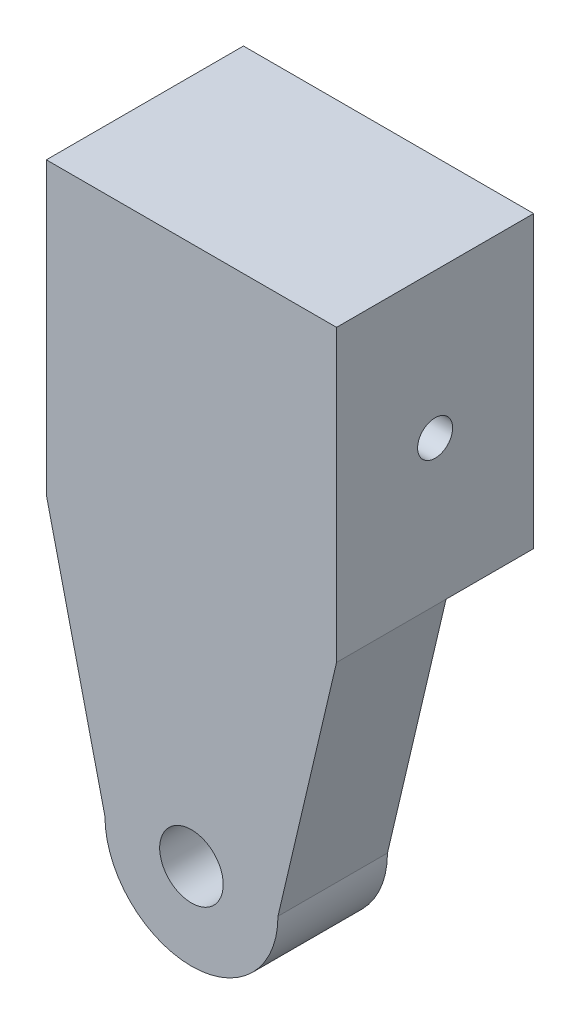
ISO-10303-21;
HEADER;
FILE_DESCRIPTION(('STEP AP214'),'2;1');
FILE_NAME('part.step','',(''),(''),'','','');
FILE_SCHEMA(('AUTOMOTIVE_DESIGN { 1 0 10303 214 1 1 1 1 }'));
ENDSEC;
DATA;
#1=APPLICATION_CONTEXT('core data for automotive mechanical design processes');
#2=APPLICATION_PROTOCOL_DEFINITION('international standard','automotive_design',2000,#1);
#3=PRODUCT_CONTEXT('',#1,'mechanical');
#4=PRODUCT('Part','Part','',(#3));
#5=PRODUCT_RELATED_PRODUCT_CATEGORY('part','',(#4));
#6=PRODUCT_DEFINITION_FORMATION('','',#4);
#7=PRODUCT_DEFINITION_CONTEXT('part definition',#1,'design');
#8=PRODUCT_DEFINITION('design','',#6,#7);
#9=PRODUCT_DEFINITION_SHAPE('','',#8);
#10=(LENGTH_UNIT() NAMED_UNIT(*) SI_UNIT(.MILLI.,.METRE.));
#11=(NAMED_UNIT(*) PLANE_ANGLE_UNIT() SI_UNIT($,.RADIAN.));
#12=(NAMED_UNIT(*) SI_UNIT($,.STERADIAN.) SOLID_ANGLE_UNIT());
#13=UNCERTAINTY_MEASURE_WITH_UNIT(LENGTH_MEASURE(1.E-05),#10,'distance_accuracy_value','');
#14=(GEOMETRIC_REPRESENTATION_CONTEXT(3) GLOBAL_UNCERTAINTY_ASSIGNED_CONTEXT((#13)) GLOBAL_UNIT_ASSIGNED_CONTEXT((#10,
#11,#12)) REPRESENTATION_CONTEXT('',''));
#15=CARTESIAN_POINT('',(0.,0.,0.));
#16=DIRECTION('',(0.,0.,1.));
#17=DIRECTION('',(1.,0.,0.));
#18=AXIS2_PLACEMENT_3D('',#15,#16,#17);
#19=CARTESIAN_POINT('',(-10.25,-10.25,9.));
#20=DIRECTION('',(1.,0.,0.));
#21=DIRECTION('',(0.,0.,-1.));
#22=AXIS2_PLACEMENT_3D('',#19,#20,#21);
#23=PLANE('',#22);
#24=CARTESIAN_POINT('',(-10.25,0.,0.));
#25=DIRECTION('',(1.,0.,0.));
#26=DIRECTION('',(0.,0.,-1.));
#27=AXIS2_PLACEMENT_3D('',#24,#25,#26);
#28=CIRCLE('',#27,1.6);
#29=CARTESIAN_POINT('',(-10.25,0.,-1.6));
#30=VERTEX_POINT('',#29);
#31=EDGE_CURVE('E286',#30,#30,#28,.T.);
#32=ORIENTED_EDGE('',*,*,#31,.F.);
#33=EDGE_LOOP('',(#32));
#34=FACE_BOUND('',#33,.T.);
#35=DIRECTION('',(0.,0.,-1.));
#36=VECTOR('',#35,1.);
#37=CARTESIAN_POINT('',(-10.25,10.25,9.));
#38=LINE('',#37,#36);
#39=CARTESIAN_POINT('',(-10.25,10.25,8.));
#40=VERTEX_POINT('',#39);
#41=CARTESIAN_POINT('',(-10.25,10.25,-9.));
#42=VERTEX_POINT('',#41);
#43=EDGE_CURVE('E215',#40,#42,#38,.T.);
#44=ORIENTED_EDGE('',*,*,#43,.F.);
#45=DIRECTION('',(0.,-1.,0.));
#46=VECTOR('',#45,1.);
#47=CARTESIAN_POINT('',(-10.25,10.25,8.));
#48=LINE('',#47,#46);
#49=CARTESIAN_POINT('',(-10.25,-10.25,8.));
#50=VERTEX_POINT('',#49);
#51=EDGE_CURVE('E174',#40,#50,#48,.T.);
#52=ORIENTED_EDGE('',*,*,#51,.T.);
#53=DIRECTION('',(0.,0.,-1.));
#54=VECTOR('',#53,1.);
#55=CARTESIAN_POINT('',(-10.25,-10.25,9.));
#56=LINE('',#55,#54);
#57=CARTESIAN_POINT('',(-10.25,-10.25,-9.));
#58=VERTEX_POINT('',#57);
#59=EDGE_CURVE('E222',#50,#58,#56,.T.);
#60=ORIENTED_EDGE('',*,*,#59,.T.);
#61=DIRECTION('',(0.,-1.,0.));
#62=VECTOR('',#61,1.);
#63=CARTESIAN_POINT('',(-10.25,-10.25,-9.));
#64=LINE('',#63,#62);
#65=EDGE_CURVE('E202',#42,#58,#64,.T.);
#66=ORIENTED_EDGE('',*,*,#65,.F.);
#67=EDGE_LOOP('',(#44,#52,#60,#66));
#68=FACE_BOUND('',#67,.T.);
#69=ADVANCED_FACE('F35',(#34,#68),#23,.T.);
#70=CARTESIAN_POINT('',(10.25,-10.25,9.));
#71=DIRECTION('',(0.,1.,0.));
#72=DIRECTION('',(-1.,0.,0.));
#73=AXIS2_PLACEMENT_3D('',#70,#71,#72);
#74=PLANE('',#73);
#75=DIRECTION('',(1.,0.,0.));
#76=VECTOR('',#75,1.);
#77=CARTESIAN_POINT('',(-10.25,-10.25,8.));
#78=LINE('',#77,#76);
#79=CARTESIAN_POINT('',(10.25,-10.25,8.));
#80=VERTEX_POINT('',#79);
#81=EDGE_CURVE('E177',#50,#80,#78,.T.);
#82=ORIENTED_EDGE('',*,*,#81,.T.);
#83=DIRECTION('',(0.,0.,-1.));
#84=VECTOR('',#83,1.);
#85=CARTESIAN_POINT('',(10.25,-10.25,9.));
#86=LINE('',#85,#84);
#87=CARTESIAN_POINT('',(10.25,-10.25,-9.));
#88=VERTEX_POINT('',#87);
#89=EDGE_CURVE('E220',#80,#88,#86,.T.);
#90=ORIENTED_EDGE('',*,*,#89,.T.);
#91=DIRECTION('',(1.,0.,0.));
#92=VECTOR('',#91,1.);
#93=CARTESIAN_POINT('',(10.25,-10.25,-9.));
#94=LINE('',#93,#92);
#95=EDGE_CURVE('E207',#58,#88,#94,.T.);
#96=ORIENTED_EDGE('',*,*,#95,.F.);
#97=ORIENTED_EDGE('',*,*,#59,.F.);
#98=EDGE_LOOP('',(#82,#90,#96,#97));
#99=FACE_BOUND('',#98,.T.);
#100=ADVANCED_FACE('F315',(#99),#74,.T.);
#101=CARTESIAN_POINT('',(10.25,-10.25,9.));
#102=DIRECTION('',(-1.,0.,0.));
#103=DIRECTION('',(0.,0.,1.));
#104=AXIS2_PLACEMENT_3D('',#101,#102,#103);
#105=PLANE('',#104);
#106=CARTESIAN_POINT('',(10.25,0.,0.));
#107=DIRECTION('',(-1.,0.,0.));
#108=DIRECTION('',(0.,0.,1.));
#109=AXIS2_PLACEMENT_3D('',#106,#107,#108);
#110=CIRCLE('',#109,1.6);
#111=CARTESIAN_POINT('',(10.25,0.,1.6));
#112=VERTEX_POINT('',#111);
#113=EDGE_CURVE('E288',#112,#112,#110,.T.);
#114=ORIENTED_EDGE('',*,*,#113,.F.);
#115=EDGE_LOOP('',(#114));
#116=FACE_BOUND('',#115,.T.);
#117=ORIENTED_EDGE('',*,*,#89,.F.);
#118=DIRECTION('',(0.,1.,0.));
#119=VECTOR('',#118,1.);
#120=CARTESIAN_POINT('',(10.25,-10.25,8.));
#121=LINE('',#120,#119);
#122=CARTESIAN_POINT('',(10.25,10.25,8.));
#123=VERTEX_POINT('',#122);
#124=EDGE_CURVE('E169',#80,#123,#121,.T.);
#125=ORIENTED_EDGE('',*,*,#124,.T.);
#126=DIRECTION('',(0.,0.,-1.));
#127=VECTOR('',#126,1.);
#128=CARTESIAN_POINT('',(10.25,10.25,9.));
#129=LINE('',#128,#127);
#130=CARTESIAN_POINT('',(10.25,10.25,-9.));
#131=VERTEX_POINT('',#130);
#132=EDGE_CURVE('E218',#123,#131,#129,.T.);
#133=ORIENTED_EDGE('',*,*,#132,.T.);
#134=DIRECTION('',(0.,1.,0.));
#135=VECTOR('',#134,1.);
#136=CARTESIAN_POINT('',(10.25,-10.25,-9.));
#137=LINE('',#136,#135);
#138=EDGE_CURVE('E210',#88,#131,#137,.T.);
#139=ORIENTED_EDGE('',*,*,#138,.F.);
#140=EDGE_LOOP('',(#117,#125,#133,#139));
#141=FACE_BOUND('',#140,.T.);
#142=ADVANCED_FACE('F321',(#116,#141),#105,.T.);
#143=CARTESIAN_POINT('',(10.25,10.25,9.));
#144=DIRECTION('',(0.,-1.,0.));
#145=DIRECTION('',(1.,0.,0.));
#146=AXIS2_PLACEMENT_3D('',#143,#144,#145);
#147=PLANE('',#146);
#148=DIRECTION('',(-1.,0.,0.));
#149=VECTOR('',#148,1.);
#150=CARTESIAN_POINT('',(10.25,10.25,8.));
#151=LINE('',#150,#149);
#152=EDGE_CURVE('E172',#123,#40,#151,.T.);
#153=ORIENTED_EDGE('',*,*,#152,.T.);
#154=ORIENTED_EDGE('',*,*,#43,.T.);
#155=DIRECTION('',(-1.,0.,0.));
#156=VECTOR('',#155,1.);
#157=CARTESIAN_POINT('',(10.25,10.25,-9.));
#158=LINE('',#157,#156);
#159=EDGE_CURVE('E213',#131,#42,#158,.T.);
#160=ORIENTED_EDGE('',*,*,#159,.F.);
#161=ORIENTED_EDGE('',*,*,#132,.F.);
#162=EDGE_LOOP('',(#153,#154,#160,#161));
#163=FACE_BOUND('',#162,.T.);
#164=ADVANCED_FACE('F329',(#163),#147,.T.);
#165=CARTESIAN_POINT('',(0.,0.,9.));
#166=DIRECTION('',(0.,0.,1.));
#167=DIRECTION('',(1.,0.,0.));
#168=AXIS2_PLACEMENT_3D('',#165,#166,#167);
#169=PLANE('',#168);
#170=DIRECTION('',(-1.,0.,0.));
#171=VECTOR('',#170,1.);
#172=CARTESIAN_POINT('',(13.25,13.25,9.));
#173=LINE('',#172,#171);
#174=CARTESIAN_POINT('',(13.25,13.25,9.));
#175=VERTEX_POINT('',#174);
#176=CARTESIAN_POINT('',(-13.25,13.25,9.));
#177=VERTEX_POINT('',#176);
#178=EDGE_CURVE('E228',#175,#177,#173,.T.);
#179=ORIENTED_EDGE('',*,*,#178,.T.);
#180=DIRECTION('',(0.,-1.,0.));
#181=VECTOR('',#180,1.);
#182=CARTESIAN_POINT('',(-13.25,-13.25,9.));
#183=LINE('',#182,#181);
#184=CARTESIAN_POINT('',(-13.25,-13.25,9.));
#185=VERTEX_POINT('',#184);
#186=EDGE_CURVE('E231',#177,#185,#183,.T.);
#187=ORIENTED_EDGE('',*,*,#186,.T.);
#188=DIRECTION('',(0.228920084529156,-0.973445219259494,0.));
#189=VECTOR('',#188,1.);
#190=CARTESIAN_POINT('',(-7.9,-36.,9.));
#191=LINE('',#190,#189);
#192=CARTESIAN_POINT('',(-7.9,-36.,9.));
#193=VERTEX_POINT('',#192);
#194=EDGE_CURVE('E180',#185,#193,#191,.T.);
#195=ORIENTED_EDGE('',*,*,#194,.T.);
#196=CARTESIAN_POINT('',(0.,-36.,9.));
#197=DIRECTION('',(0.,0.,1.));
#198=DIRECTION('',(1.,0.,0.));
#199=AXIS2_PLACEMENT_3D('',#196,#197,#198);
#200=CIRCLE('',#199,7.9);
#201=CARTESIAN_POINT('',(7.9,-36.,9.));
#202=VERTEX_POINT('',#201);
#203=EDGE_CURVE('E186',#193,#202,#200,.T.);
#204=ORIENTED_EDGE('',*,*,#203,.T.);
#205=DIRECTION('',(0.228920084529156,0.973445219259494,0.));
#206=VECTOR('',#205,1.);
#207=CARTESIAN_POINT('',(13.25,-13.25,9.));
#208=LINE('',#207,#206);
#209=CARTESIAN_POINT('',(13.25,-13.25,9.));
#210=VERTEX_POINT('',#209);
#211=EDGE_CURVE('E183',#202,#210,#208,.T.);
#212=ORIENTED_EDGE('',*,*,#211,.T.);
#213=DIRECTION('',(0.,1.,0.));
#214=VECTOR('',#213,1.);
#215=CARTESIAN_POINT('',(13.25,-13.25,9.));
#216=LINE('',#215,#214);
#217=EDGE_CURVE('E225',#210,#175,#216,.T.);
#218=ORIENTED_EDGE('',*,*,#217,.T.);
#219=EDGE_LOOP('',(#179,#187,#195,#204,#212,#218));
#220=FACE_BOUND('',#219,.T.);
#221=CARTESIAN_POINT('',(0.,-36.,9.));
#222=DIRECTION('',(0.,0.,1.));
#223=DIRECTION('',(1.,0.,0.));
#224=AXIS2_PLACEMENT_3D('',#221,#222,#223);
#225=CIRCLE('',#224,2.9);
#226=CARTESIAN_POINT('',(2.9,-36.,9.));
#227=VERTEX_POINT('',#226);
#228=EDGE_CURVE('E179',#227,#227,#225,.T.);
#229=ORIENTED_EDGE('',*,*,#228,.F.);
#230=EDGE_LOOP('',(#229));
#231=FACE_BOUND('',#230,.T.);
#232=ADVANCED_FACE('F269',(#220,#231),#169,.T.);
#233=CARTESIAN_POINT('',(0.,0.,-9.));
#234=DIRECTION('',(0.,0.,1.));
#235=DIRECTION('',(1.,0.,0.));
#236=AXIS2_PLACEMENT_3D('',#233,#234,#235);
#237=PLANE('',#236);
#238=DIRECTION('',(0.,-1.,0.));
#239=VECTOR('',#238,1.);
#240=CARTESIAN_POINT('',(-13.25,-13.25,-9.));
#241=LINE('',#240,#239);
#242=CARTESIAN_POINT('',(-13.25,13.25,-9.));
#243=VERTEX_POINT('',#242);
#244=CARTESIAN_POINT('',(-13.25,-13.25,-9.));
#245=VERTEX_POINT('',#244);
#246=EDGE_CURVE('E239',#243,#245,#241,.T.);
#247=ORIENTED_EDGE('',*,*,#246,.F.);
#248=DIRECTION('',(-1.,0.,0.));
#249=VECTOR('',#248,1.);
#250=CARTESIAN_POINT('',(13.25,13.25,-9.));
#251=LINE('',#250,#249);
#252=CARTESIAN_POINT('',(13.25,13.25,-9.));
#253=VERTEX_POINT('',#252);
#254=EDGE_CURVE('E237',#253,#243,#251,.T.);
#255=ORIENTED_EDGE('',*,*,#254,.F.);
#256=DIRECTION('',(0.,1.,0.));
#257=VECTOR('',#256,1.);
#258=CARTESIAN_POINT('',(13.25,-13.25,-9.));
#259=LINE('',#258,#257);
#260=CARTESIAN_POINT('',(13.25,-13.25,-9.));
#261=VERTEX_POINT('',#260);
#262=EDGE_CURVE('E224',#261,#253,#259,.T.);
#263=ORIENTED_EDGE('',*,*,#262,.F.);
#264=DIRECTION('',(1.,0.,0.));
#265=VECTOR('',#264,1.);
#266=CARTESIAN_POINT('',(13.25,-13.25,-9.));
#267=LINE('',#266,#265);
#268=EDGE_CURVE('E229',#245,#261,#267,.T.);
#269=ORIENTED_EDGE('',*,*,#268,.F.);
#270=EDGE_LOOP('',(#247,#255,#263,#269));
#271=FACE_BOUND('',#270,.T.);
#272=ORIENTED_EDGE('',*,*,#159,.T.);
#273=ORIENTED_EDGE('',*,*,#65,.T.);
#274=ORIENTED_EDGE('',*,*,#95,.T.);
#275=ORIENTED_EDGE('',*,*,#138,.T.);
#276=EDGE_LOOP('',(#272,#273,#274,#275));
#277=FACE_BOUND('',#276,.T.);
#278=ADVANCED_FACE('F261',(#271,#277),#237,.F.);
#279=CARTESIAN_POINT('',(13.25,-13.25,9.));
#280=DIRECTION('',(-1.,0.,0.));
#281=DIRECTION('',(0.,0.,1.));
#282=AXIS2_PLACEMENT_3D('',#279,#280,#281);
#283=PLANE('',#282);
#284=CARTESIAN_POINT('',(13.25,0.,0.));
#285=DIRECTION('',(-1.,0.,0.));
#286=DIRECTION('',(0.,0.,1.));
#287=AXIS2_PLACEMENT_3D('',#284,#285,#286);
#288=CIRCLE('',#287,1.6);
#289=CARTESIAN_POINT('',(13.25,0.,1.6));
#290=VERTEX_POINT('',#289);
#291=EDGE_CURVE('E293',#290,#290,#288,.T.);
#292=ORIENTED_EDGE('',*,*,#291,.T.);
#293=EDGE_LOOP('',(#292));
#294=FACE_BOUND('',#293,.T.);
#295=ORIENTED_EDGE('',*,*,#262,.T.);
#296=DIRECTION('',(0.,0.,-1.));
#297=VECTOR('',#296,1.);
#298=CARTESIAN_POINT('',(13.25,13.25,9.));
#299=LINE('',#298,#297);
#300=EDGE_CURVE('E11',#175,#253,#299,.T.);
#301=ORIENTED_EDGE('',*,*,#300,.F.);
#302=ORIENTED_EDGE('',*,*,#217,.F.);
#303=DIRECTION('',(0.,0.,-1.));
#304=VECTOR('',#303,1.);
#305=CARTESIAN_POINT('',(13.25,-13.25,9.));
#306=LINE('',#305,#304);
#307=CARTESIAN_POINT('',(13.25,-13.25,-1.));
#308=VERTEX_POINT('',#307);
#309=EDGE_CURVE('E244',#210,#308,#306,.T.);
#310=ORIENTED_EDGE('',*,*,#309,.T.);
#311=EDGE_CURVE('E234',#308,#261,#306,.T.);
#312=ORIENTED_EDGE('',*,*,#311,.T.);
#313=EDGE_LOOP('',(#295,#301,#302,#310,#312));
#314=FACE_BOUND('',#313,.T.);
#315=ADVANCED_FACE('F37',(#294,#314),#283,.F.);
#316=CARTESIAN_POINT('',(13.25,13.25,9.));
#317=DIRECTION('',(0.,-1.,0.));
#318=DIRECTION('',(1.,0.,0.));
#319=AXIS2_PLACEMENT_3D('',#316,#317,#318);
#320=PLANE('',#319);
#321=ORIENTED_EDGE('',*,*,#254,.T.);
#322=DIRECTION('',(0.,0.,-1.));
#323=VECTOR('',#322,1.);
#324=CARTESIAN_POINT('',(-13.25,13.25,9.));
#325=LINE('',#324,#323);
#326=EDGE_CURVE('E44',#177,#243,#325,.T.);
#327=ORIENTED_EDGE('',*,*,#326,.F.);
#328=ORIENTED_EDGE('',*,*,#178,.F.);
#329=ORIENTED_EDGE('',*,*,#300,.T.);
#330=EDGE_LOOP('',(#321,#327,#328,#329));
#331=FACE_BOUND('',#330,.T.);
#332=ADVANCED_FACE('F273',(#331),#320,.F.);
#333=CARTESIAN_POINT('',(-13.25,-13.25,9.));
#334=DIRECTION('',(1.,0.,0.));
#335=DIRECTION('',(0.,0.,-1.));
#336=AXIS2_PLACEMENT_3D('',#333,#334,#335);
#337=PLANE('',#336);
#338=CARTESIAN_POINT('',(-13.25,0.,0.));
#339=DIRECTION('',(1.,0.,0.));
#340=DIRECTION('',(0.,0.,-1.));
#341=AXIS2_PLACEMENT_3D('',#338,#339,#340);
#342=CIRCLE('',#341,1.6);
#343=CARTESIAN_POINT('',(-13.25,0.,-1.6));
#344=VERTEX_POINT('',#343);
#345=EDGE_CURVE('E39',#344,#344,#342,.T.);
#346=ORIENTED_EDGE('',*,*,#345,.T.);
#347=EDGE_LOOP('',(#346));
#348=FACE_BOUND('',#347,.T.);
#349=ORIENTED_EDGE('',*,*,#246,.T.);
#350=DIRECTION('',(0.,0.,-1.));
#351=VECTOR('',#350,1.);
#352=CARTESIAN_POINT('',(-13.25,-13.25,9.));
#353=LINE('',#352,#351);
#354=CARTESIAN_POINT('',(-13.25,-13.25,-0.999999999999999));
#355=VERTEX_POINT('',#354);
#356=EDGE_CURVE('E247',#355,#245,#353,.T.);
#357=ORIENTED_EDGE('',*,*,#356,.F.);
#358=EDGE_CURVE('E248',#185,#355,#353,.T.);
#359=ORIENTED_EDGE('',*,*,#358,.F.);
#360=ORIENTED_EDGE('',*,*,#186,.F.);
#361=ORIENTED_EDGE('',*,*,#326,.T.);
#362=EDGE_LOOP('',(#349,#357,#359,#360,#361));
#363=FACE_BOUND('',#362,.T.);
#364=ADVANCED_FACE('F255',(#348,#363),#337,.F.);
#365=CARTESIAN_POINT('',(13.25,-13.25,9.));
#366=DIRECTION('',(0.,1.,0.));
#367=DIRECTION('',(-1.,0.,0.));
#368=AXIS2_PLACEMENT_3D('',#365,#366,#367);
#369=PLANE('',#368);
#370=DIRECTION('',(-1.,0.,0.));
#371=VECTOR('',#370,1.);
#372=CARTESIAN_POINT('',(-13.25,-13.25,-1.));
#373=LINE('',#372,#371);
#374=CARTESIAN_POINT('',(5.,-13.25,-1.));
#375=VERTEX_POINT('',#374);
#376=EDGE_CURVE('E146',#308,#375,#373,.T.);
#377=ORIENTED_EDGE('',*,*,#376,.T.);
#378=DIRECTION('',(0.,0.,-1.));
#379=VECTOR('',#378,1.);
#380=CARTESIAN_POINT('',(5.,-13.25,9.));
#381=LINE('',#380,#379);
#382=CARTESIAN_POINT('',(5.,-13.25,-7.5));
#383=VERTEX_POINT('',#382);
#384=EDGE_CURVE('E51',#375,#383,#381,.T.);
#385=ORIENTED_EDGE('',*,*,#384,.T.);
#386=DIRECTION('',(-1.,0.,0.));
#387=VECTOR('',#386,1.);
#388=CARTESIAN_POINT('',(13.25,-13.25,-7.5));
#389=LINE('',#388,#387);
#390=CARTESIAN_POINT('',(-5.,-13.25,-7.5));
#391=VERTEX_POINT('',#390);
#392=EDGE_CURVE('E55',#383,#391,#389,.T.);
#393=ORIENTED_EDGE('',*,*,#392,.T.);
#394=DIRECTION('',(0.,0.,-1.));
#395=VECTOR('',#394,1.);
#396=CARTESIAN_POINT('',(-5.,-13.25,9.));
#397=LINE('',#396,#395);
#398=CARTESIAN_POINT('',(-5.,-13.25,-1.));
#399=VERTEX_POINT('',#398);
#400=EDGE_CURVE('E149',#399,#391,#397,.T.);
#401=ORIENTED_EDGE('',*,*,#400,.F.);
#402=EDGE_CURVE('E136',#399,#355,#373,.T.);
#403=ORIENTED_EDGE('',*,*,#402,.T.);
#404=ORIENTED_EDGE('',*,*,#356,.T.);
#405=ORIENTED_EDGE('',*,*,#268,.T.);
#406=ORIENTED_EDGE('',*,*,#311,.F.);
#407=EDGE_LOOP('',(#377,#385,#393,#401,#403,#404,#405,#406));
#408=FACE_BOUND('',#407,.T.);
#409=ADVANCED_FACE('F150',(#408),#369,.F.);
#410=CARTESIAN_POINT('',(0.,-36.,-1.));
#411=DIRECTION('',(0.,0.,1.));
#412=DIRECTION('',(1.,0.,0.));
#413=AXIS2_PLACEMENT_3D('',#410,#411,#412);
#414=CYLINDRICAL_SURFACE('',#413,7.9);
#415=DIRECTION('',(0.,0.,1.));
#416=VECTOR('',#415,1.);
#417=CARTESIAN_POINT('',(7.9,-36.,-1.));
#418=LINE('',#417,#416);
#419=CARTESIAN_POINT('',(7.9,-36.,-1.));
#420=VERTEX_POINT('',#419);
#421=EDGE_CURVE('E199',#420,#202,#418,.T.);
#422=ORIENTED_EDGE('',*,*,#421,.T.);
#423=ORIENTED_EDGE('',*,*,#203,.F.);
#424=DIRECTION('',(0.,0.,1.));
#425=VECTOR('',#424,1.);
#426=CARTESIAN_POINT('',(-7.9,-36.,-1.));
#427=LINE('',#426,#425);
#428=CARTESIAN_POINT('',(-7.9,-36.,-1.));
#429=VERTEX_POINT('',#428);
#430=EDGE_CURVE('E200',#429,#193,#427,.T.);
#431=ORIENTED_EDGE('',*,*,#430,.F.);
#432=CARTESIAN_POINT('',(0.,-36.,-1.));
#433=DIRECTION('',(0.,0.,1.));
#434=DIRECTION('',(1.,0.,0.));
#435=AXIS2_PLACEMENT_3D('',#432,#433,#434);
#436=CIRCLE('',#435,7.9);
#437=EDGE_CURVE('E193',#429,#420,#436,.T.);
#438=ORIENTED_EDGE('',*,*,#437,.T.);
#439=EDGE_LOOP('',(#422,#423,#431,#438));
#440=FACE_BOUND('',#439,.T.);
#441=ADVANCED_FACE('F280',(#440),#414,.T.);
#442=CARTESIAN_POINT('',(-7.9,-36.,-1.));
#443=DIRECTION('',(-0.973445219259494,-0.228920084529156,0.));
#444=DIRECTION('',(0.228920084529156,-0.973445219259494,0.));
#445=AXIS2_PLACEMENT_3D('',#442,#443,#444);
#446=PLANE('',#445);
#447=ORIENTED_EDGE('',*,*,#430,.T.);
#448=ORIENTED_EDGE('',*,*,#194,.F.);
#449=ORIENTED_EDGE('',*,*,#358,.T.);
#450=DIRECTION('',(0.228920084529156,-0.973445219259494,0.));
#451=VECTOR('',#450,1.);
#452=CARTESIAN_POINT('',(-7.9,-36.,-1.));
#453=LINE('',#452,#451);
#454=EDGE_CURVE('E144',#355,#429,#453,.T.);
#455=ORIENTED_EDGE('',*,*,#454,.T.);
#456=EDGE_LOOP('',(#447,#448,#449,#455));
#457=FACE_BOUND('',#456,.T.);
#458=ADVANCED_FACE('F266',(#457),#446,.T.);
#459=CARTESIAN_POINT('',(13.25,-13.25,-1.));
#460=DIRECTION('',(0.973445219259494,-0.228920084529156,0.));
#461=DIRECTION('',(0.228920084529156,0.973445219259494,0.));
#462=AXIS2_PLACEMENT_3D('',#459,#460,#461);
#463=PLANE('',#462);
#464=ORIENTED_EDGE('',*,*,#309,.F.);
#465=ORIENTED_EDGE('',*,*,#211,.F.);
#466=ORIENTED_EDGE('',*,*,#421,.F.);
#467=DIRECTION('',(0.228920084529156,0.973445219259494,0.));
#468=VECTOR('',#467,1.);
#469=CARTESIAN_POINT('',(13.25,-13.25,-1.));
#470=LINE('',#469,#468);
#471=EDGE_CURVE('E147',#420,#308,#470,.T.);
#472=ORIENTED_EDGE('',*,*,#471,.T.);
#473=EDGE_LOOP('',(#464,#465,#466,#472));
#474=FACE_BOUND('',#473,.T.);
#475=ADVANCED_FACE('F277',(#474),#463,.T.);
#476=CARTESIAN_POINT('',(0.,-36.,-1.));
#477=DIRECTION('',(0.,0.,1.));
#478=DIRECTION('',(1.,0.,0.));
#479=AXIS2_PLACEMENT_3D('',#476,#477,#478);
#480=PLANE('',#479);
#481=CARTESIAN_POINT('',(0.,-36.,-1.));
#482=DIRECTION('',(0.,0.,1.));
#483=DIRECTION('',(1.,0.,0.));
#484=AXIS2_PLACEMENT_3D('',#481,#482,#483);
#485=CIRCLE('',#484,2.9);
#486=CARTESIAN_POINT('',(2.9,-36.,-1.));
#487=VERTEX_POINT('',#486);
#488=EDGE_CURVE('E188',#487,#487,#485,.T.);
#489=ORIENTED_EDGE('',*,*,#488,.T.);
#490=EDGE_LOOP('',(#489));
#491=FACE_BOUND('',#490,.T.);
#492=DIRECTION('',(1.,0.,0.));
#493=VECTOR('',#492,1.);
#494=CARTESIAN_POINT('',(0.,-28.25,-1.));
#495=LINE('',#494,#493);
#496=CARTESIAN_POINT('',(-5.,-28.25,-1.));
#497=VERTEX_POINT('',#496);
#498=CARTESIAN_POINT('',(5.,-28.25,-1.));
#499=VERTEX_POINT('',#498);
#500=EDGE_CURVE('E166',#497,#499,#495,.T.);
#501=ORIENTED_EDGE('',*,*,#500,.T.);
#502=DIRECTION('',(0.,1.,0.));
#503=VECTOR('',#502,1.);
#504=CARTESIAN_POINT('',(5.,-36.,-1.));
#505=LINE('',#504,#503);
#506=EDGE_CURVE('E154',#499,#375,#505,.T.);
#507=ORIENTED_EDGE('',*,*,#506,.T.);
#508=ORIENTED_EDGE('',*,*,#376,.F.);
#509=ORIENTED_EDGE('',*,*,#471,.F.);
#510=ORIENTED_EDGE('',*,*,#437,.F.);
#511=ORIENTED_EDGE('',*,*,#454,.F.);
#512=ORIENTED_EDGE('',*,*,#402,.F.);
#513=DIRECTION('',(0.,1.,0.));
#514=VECTOR('',#513,1.);
#515=CARTESIAN_POINT('',(-5.,-36.,-1.));
#516=LINE('',#515,#514);
#517=EDGE_CURVE('E140',#497,#399,#516,.T.);
#518=ORIENTED_EDGE('',*,*,#517,.F.);
#519=EDGE_LOOP('',(#501,#507,#508,#509,#510,#511,#512,#518));
#520=FACE_BOUND('',#519,.T.);
#521=ADVANCED_FACE('F138',(#491,#520),#480,.F.);
#522=CARTESIAN_POINT('',(0.,-36.,-1.));
#523=DIRECTION('',(0.,0.,1.));
#524=DIRECTION('',(1.,0.,0.));
#525=AXIS2_PLACEMENT_3D('',#522,#523,#524);
#526=CYLINDRICAL_SURFACE('',#525,2.9);
#527=ORIENTED_EDGE('',*,*,#488,.F.);
#528=EDGE_LOOP('',(#527));
#529=FACE_BOUND('',#528,.T.);
#530=ORIENTED_EDGE('',*,*,#228,.T.);
#531=EDGE_LOOP('',(#530));
#532=FACE_BOUND('',#531,.T.);
#533=ADVANCED_FACE('F441',(#529,#532),#526,.F.);
#534=CARTESIAN_POINT('',(0.,0.,8.));
#535=DIRECTION('',(0.,0.,1.));
#536=DIRECTION('',(1.,0.,0.));
#537=AXIS2_PLACEMENT_3D('',#534,#535,#536);
#538=PLANE('',#537);
#539=ORIENTED_EDGE('',*,*,#124,.F.);
#540=ORIENTED_EDGE('',*,*,#81,.F.);
#541=ORIENTED_EDGE('',*,*,#51,.F.);
#542=ORIENTED_EDGE('',*,*,#152,.F.);
#543=EDGE_LOOP('',(#539,#540,#541,#542));
#544=FACE_BOUND('',#543,.T.);
#545=ADVANCED_FACE('F434',(#544),#538,.F.);
#546=CARTESIAN_POINT('',(0.,-28.25,-1.));
#547=DIRECTION('',(0.,-0.397607437634301,-0.917555625309924));
#548=DIRECTION('',(0.,0.917555625309924,-0.3976074376343));
#549=AXIS2_PLACEMENT_3D('',#546,#547,#548);
#550=PLANE('',#549);
#551=ORIENTED_EDGE('',*,*,#392,.F.);
#552=DIRECTION('',(0.,0.917555625309924,-0.3976074376343));
#553=VECTOR('',#552,1.);
#554=CARTESIAN_POINT('',(5.,-28.25,-1.));
#555=LINE('',#554,#553);
#556=EDGE_CURVE('E158',#499,#383,#555,.T.);
#557=ORIENTED_EDGE('',*,*,#556,.F.);
#558=ORIENTED_EDGE('',*,*,#500,.F.);
#559=DIRECTION('',(0.,0.917555625309924,-0.3976074376343));
#560=VECTOR('',#559,1.);
#561=CARTESIAN_POINT('',(-5.,-28.25,-1.));
#562=LINE('',#561,#560);
#563=EDGE_CURVE('E157',#497,#391,#562,.T.);
#564=ORIENTED_EDGE('',*,*,#563,.T.);
#565=EDGE_LOOP('',(#551,#557,#558,#564));
#566=FACE_BOUND('',#565,.T.);
#567=ADVANCED_FACE('F285',(#566),#550,.T.);
#568=CARTESIAN_POINT('',(5.,-15.325,0.));
#569=DIRECTION('',(1.,0.,0.));
#570=DIRECTION('',(0.,0.,-1.));
#571=AXIS2_PLACEMENT_3D('',#568,#569,#570);
#572=PLANE('',#571);
#573=ORIENTED_EDGE('',*,*,#506,.F.);
#574=ORIENTED_EDGE('',*,*,#556,.T.);
#575=ORIENTED_EDGE('',*,*,#384,.F.);
#576=EDGE_LOOP('',(#573,#574,#575));
#577=FACE_BOUND('',#576,.T.);
#578=ADVANCED_FACE('F282',(#577),#572,.T.);
#579=CARTESIAN_POINT('',(-5.,-15.325,0.));
#580=DIRECTION('',(1.,0.,0.));
#581=DIRECTION('',(0.,0.,-1.));
#582=AXIS2_PLACEMENT_3D('',#579,#580,#581);
#583=PLANE('',#582);
#584=ORIENTED_EDGE('',*,*,#517,.T.);
#585=ORIENTED_EDGE('',*,*,#400,.T.);
#586=ORIENTED_EDGE('',*,*,#563,.F.);
#587=EDGE_LOOP('',(#584,#585,#586));
#588=FACE_BOUND('',#587,.T.);
#589=ADVANCED_FACE('F156',(#588),#583,.F.);
#590=CARTESIAN_POINT('',(-25.,0.,0.));
#591=DIRECTION('',(1.,0.,0.));
#592=DIRECTION('',(0.,0.,-1.));
#593=AXIS2_PLACEMENT_3D('',#590,#591,#592);
#594=CYLINDRICAL_SURFACE('',#593,1.6);
#595=ORIENTED_EDGE('',*,*,#31,.T.);
#596=EDGE_LOOP('',(#595));
#597=FACE_BOUND('',#596,.T.);
#598=ORIENTED_EDGE('',*,*,#345,.F.);
#599=EDGE_LOOP('',(#598));
#600=FACE_BOUND('',#599,.T.);
#601=ADVANCED_FACE('F303',(#597,#600),#594,.F.);
#602=ORIENTED_EDGE('',*,*,#113,.T.);
#603=EDGE_LOOP('',(#602));
#604=FACE_BOUND('',#603,.T.);
#605=ORIENTED_EDGE('',*,*,#291,.F.);
#606=EDGE_LOOP('',(#605));
#607=FACE_BOUND('',#606,.T.);
#608=ADVANCED_FACE('F305',(#604,#607),#594,.F.);
#609=CLOSED_SHELL('',(#69,#100,#142,#164,#232,#278,#315,#332,#364,#409,#441,#458,#475,#521,#533,
#545,#567,#578,#589,#601,#608));
#610=MANIFOLD_SOLID_BREP('B2',#609);
#611=ADVANCED_BREP_SHAPE_REPRESENTATION('',(#18,#610),#14);
#612=SHAPE_DEFINITION_REPRESENTATION(#9,#611);
ENDSEC;
END-ISO-10303-21;
